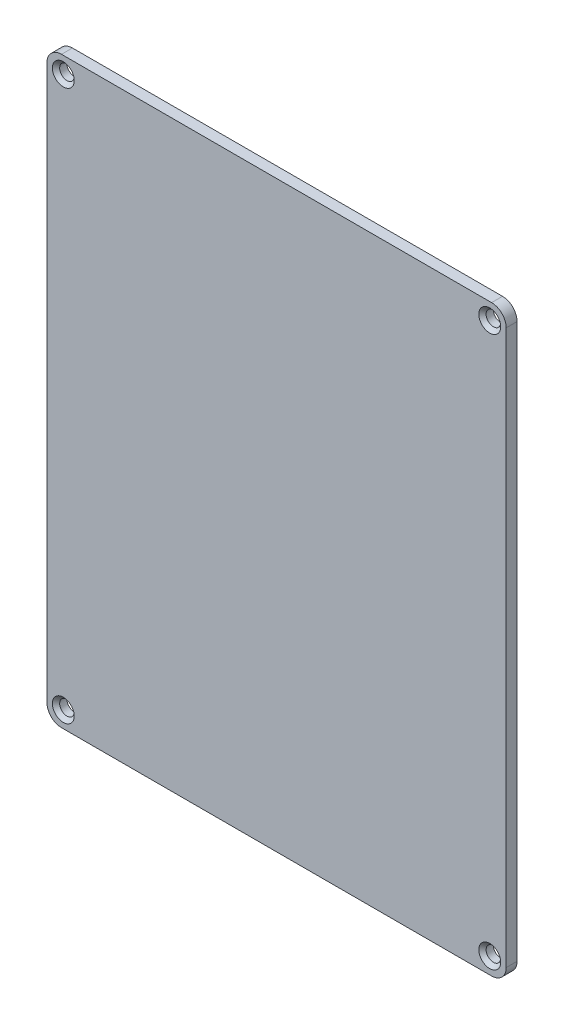
ISO-10303-21;
HEADER;
FILE_DESCRIPTION(('STEP AP214'),'2;1');
FILE_NAME('part.step','',(''),(''),'','','');
FILE_SCHEMA(('AUTOMOTIVE_DESIGN { 1 0 10303 214 1 1 1 1 }'));
ENDSEC;
DATA;
#1=APPLICATION_CONTEXT('core data for automotive mechanical design processes');
#2=APPLICATION_PROTOCOL_DEFINITION('international standard','automotive_design',2000,#1);
#3=PRODUCT_CONTEXT('',#1,'mechanical');
#4=PRODUCT('Part','Part','',(#3));
#5=PRODUCT_RELATED_PRODUCT_CATEGORY('part','',(#4));
#6=PRODUCT_DEFINITION_FORMATION('','',#4);
#7=PRODUCT_DEFINITION_CONTEXT('part definition',#1,'design');
#8=PRODUCT_DEFINITION('design','',#6,#7);
#9=PRODUCT_DEFINITION_SHAPE('','',#8);
#10=(LENGTH_UNIT() NAMED_UNIT(*) SI_UNIT(.MILLI.,.METRE.));
#11=(NAMED_UNIT(*) PLANE_ANGLE_UNIT() SI_UNIT($,.RADIAN.));
#12=(NAMED_UNIT(*) SI_UNIT($,.STERADIAN.) SOLID_ANGLE_UNIT());
#13=UNCERTAINTY_MEASURE_WITH_UNIT(LENGTH_MEASURE(1.E-05),#10,'distance_accuracy_value','');
#14=(GEOMETRIC_REPRESENTATION_CONTEXT(3) GLOBAL_UNCERTAINTY_ASSIGNED_CONTEXT((#13)) GLOBAL_UNIT_ASSIGNED_CONTEXT((#10,
#11,#12)) REPRESENTATION_CONTEXT('',''));
#15=CARTESIAN_POINT('',(0.,0.,0.));
#16=DIRECTION('',(0.,0.,1.));
#17=DIRECTION('',(1.,0.,0.));
#18=AXIS2_PLACEMENT_3D('',#15,#16,#17);
#19=CARTESIAN_POINT('',(31.5,-40.,1.5));
#20=DIRECTION('',(-1.,0.,0.));
#21=DIRECTION('',(0.,0.,1.));
#22=AXIS2_PLACEMENT_3D('',#19,#20,#21);
#23=PLANE('',#22);
#24=DIRECTION('',(0.,1.,0.));
#25=VECTOR('',#24,1.);
#26=CARTESIAN_POINT('',(31.5,-40.,1.5));
#27=LINE('',#26,#25);
#28=CARTESIAN_POINT('',(31.5,-38.,1.5));
#29=VERTEX_POINT('',#28);
#30=CARTESIAN_POINT('',(31.5,38.,1.5));
#31=VERTEX_POINT('',#30);
#32=EDGE_CURVE('E136',#29,#31,#27,.T.);
#33=ORIENTED_EDGE('',*,*,#32,.F.);
#34=DIRECTION('',(0.,0.,-1.));
#35=VECTOR('',#34,1.);
#36=CARTESIAN_POINT('',(31.5,-38.,1.5));
#37=LINE('',#36,#35);
#38=CARTESIAN_POINT('',(31.5,-38.,0.));
#39=VERTEX_POINT('',#38);
#40=EDGE_CURVE('E175',#29,#39,#37,.T.);
#41=ORIENTED_EDGE('',*,*,#40,.T.);
#42=DIRECTION('',(0.,1.,0.));
#43=VECTOR('',#42,1.);
#44=CARTESIAN_POINT('',(31.5,-40.,0.));
#45=LINE('',#44,#43);
#46=CARTESIAN_POINT('',(31.5,38.,0.));
#47=VERTEX_POINT('',#46);
#48=EDGE_CURVE('E272',#39,#47,#45,.T.);
#49=ORIENTED_EDGE('',*,*,#48,.T.);
#50=DIRECTION('',(0.,0.,-1.));
#51=VECTOR('',#50,1.);
#52=CARTESIAN_POINT('',(31.5,38.,1.5));
#53=LINE('',#52,#51);
#54=EDGE_CURVE('E172',#47,#31,#53,.F.);
#55=ORIENTED_EDGE('',*,*,#54,.T.);
#56=EDGE_LOOP('',(#33,#41,#49,#55));
#57=FACE_BOUND('',#56,.T.);
#58=ADVANCED_FACE('F39',(#57),#23,.F.);
#59=CARTESIAN_POINT('',(-31.5,40.,1.5));
#60=DIRECTION('',(0.,-1.,0.));
#61=DIRECTION('',(0.,0.,-1.));
#62=AXIS2_PLACEMENT_3D('',#59,#60,#61);
#63=PLANE('',#62);
#64=DIRECTION('',(-1.,0.,0.));
#65=VECTOR('',#64,1.);
#66=CARTESIAN_POINT('',(-31.5,40.,1.5));
#67=LINE('',#66,#65);
#68=CARTESIAN_POINT('',(29.5,40.,1.5));
#69=VERTEX_POINT('',#68);
#70=CARTESIAN_POINT('',(-29.5,40.,1.5));
#71=VERTEX_POINT('',#70);
#72=EDGE_CURVE('E141',#69,#71,#67,.T.);
#73=ORIENTED_EDGE('',*,*,#72,.F.);
#74=DIRECTION('',(0.,0.,-1.));
#75=VECTOR('',#74,1.);
#76=CARTESIAN_POINT('',(29.5,40.,1.5));
#77=LINE('',#76,#75);
#78=CARTESIAN_POINT('',(29.5,40.,0.));
#79=VERTEX_POINT('',#78);
#80=EDGE_CURVE('E181',#69,#79,#77,.T.);
#81=ORIENTED_EDGE('',*,*,#80,.T.);
#82=DIRECTION('',(-1.,0.,0.));
#83=VECTOR('',#82,1.);
#84=CARTESIAN_POINT('',(-31.5,40.,0.));
#85=LINE('',#84,#83);
#86=CARTESIAN_POINT('',(-29.5,40.,0.));
#87=VERTEX_POINT('',#86);
#88=EDGE_CURVE('E143',#79,#87,#85,.T.);
#89=ORIENTED_EDGE('',*,*,#88,.T.);
#90=DIRECTION('',(0.,0.,-1.));
#91=VECTOR('',#90,1.);
#92=CARTESIAN_POINT('',(-29.5,40.,1.5));
#93=LINE('',#92,#91);
#94=EDGE_CURVE('E55',#87,#71,#93,.F.);
#95=ORIENTED_EDGE('',*,*,#94,.T.);
#96=EDGE_LOOP('',(#73,#81,#89,#95));
#97=FACE_BOUND('',#96,.T.);
#98=ADVANCED_FACE('F229',(#97),#63,.F.);
#99=CARTESIAN_POINT('',(-31.5,-40.,1.5));
#100=DIRECTION('',(1.,0.,0.));
#101=DIRECTION('',(0.,0.,-1.));
#102=AXIS2_PLACEMENT_3D('',#99,#100,#101);
#103=PLANE('',#102);
#104=DIRECTION('',(0.,-1.,0.));
#105=VECTOR('',#104,1.);
#106=CARTESIAN_POINT('',(-31.5,-40.,0.));
#107=LINE('',#106,#105);
#108=CARTESIAN_POINT('',(-31.5,38.,0.));
#109=VERTEX_POINT('',#108);
#110=CARTESIAN_POINT('',(-31.5,-38.,0.));
#111=VERTEX_POINT('',#110);
#112=EDGE_CURVE('E137',#109,#111,#107,.T.);
#113=ORIENTED_EDGE('',*,*,#112,.T.);
#114=DIRECTION('',(0.,0.,-1.));
#115=VECTOR('',#114,1.);
#116=CARTESIAN_POINT('',(-31.5,-38.,1.5));
#117=LINE('',#116,#115);
#118=CARTESIAN_POINT('',(-31.5,-38.,1.5));
#119=VERTEX_POINT('',#118);
#120=EDGE_CURVE('E112',#111,#119,#117,.F.);
#121=ORIENTED_EDGE('',*,*,#120,.T.);
#122=DIRECTION('',(0.,-1.,0.));
#123=VECTOR('',#122,1.);
#124=CARTESIAN_POINT('',(-31.5,-40.,1.5));
#125=LINE('',#124,#123);
#126=CARTESIAN_POINT('',(-31.5,38.,1.5));
#127=VERTEX_POINT('',#126);
#128=EDGE_CURVE('E288',#127,#119,#125,.T.);
#129=ORIENTED_EDGE('',*,*,#128,.F.);
#130=DIRECTION('',(0.,0.,-1.));
#131=VECTOR('',#130,1.);
#132=CARTESIAN_POINT('',(-31.5,38.,1.5));
#133=LINE('',#132,#131);
#134=EDGE_CURVE('E118',#127,#109,#133,.T.);
#135=ORIENTED_EDGE('',*,*,#134,.T.);
#136=EDGE_LOOP('',(#113,#121,#129,#135));
#137=FACE_BOUND('',#136,.T.);
#138=ADVANCED_FACE('F235',(#137),#103,.F.);
#139=CARTESIAN_POINT('',(-31.5,-40.,1.5));
#140=DIRECTION('',(0.,1.,0.));
#141=DIRECTION('',(0.,0.,1.));
#142=AXIS2_PLACEMENT_3D('',#139,#140,#141);
#143=PLANE('',#142);
#144=DIRECTION('',(1.,0.,0.));
#145=VECTOR('',#144,1.);
#146=CARTESIAN_POINT('',(-31.5,-40.,1.5));
#147=LINE('',#146,#145);
#148=CARTESIAN_POINT('',(-29.5,-40.,1.5));
#149=VERTEX_POINT('',#148);
#150=CARTESIAN_POINT('',(29.5,-40.,1.5));
#151=VERTEX_POINT('',#150);
#152=EDGE_CURVE('E128',#149,#151,#147,.T.);
#153=ORIENTED_EDGE('',*,*,#152,.F.);
#154=DIRECTION('',(0.,0.,-1.));
#155=VECTOR('',#154,1.);
#156=CARTESIAN_POINT('',(-29.5,-40.,1.5));
#157=LINE('',#156,#155);
#158=CARTESIAN_POINT('',(-29.5,-40.,0.));
#159=VERTEX_POINT('',#158);
#160=EDGE_CURVE('E111',#149,#159,#157,.T.);
#161=ORIENTED_EDGE('',*,*,#160,.T.);
#162=DIRECTION('',(1.,0.,0.));
#163=VECTOR('',#162,1.);
#164=CARTESIAN_POINT('',(-31.5,-40.,0.));
#165=LINE('',#164,#163);
#166=CARTESIAN_POINT('',(29.5,-40.,0.));
#167=VERTEX_POINT('',#166);
#168=EDGE_CURVE('E125',#159,#167,#165,.T.);
#169=ORIENTED_EDGE('',*,*,#168,.T.);
#170=DIRECTION('',(0.,0.,-1.));
#171=VECTOR('',#170,1.);
#172=CARTESIAN_POINT('',(29.5,-40.,1.5));
#173=LINE('',#172,#171);
#174=EDGE_CURVE('E131',#167,#151,#173,.F.);
#175=ORIENTED_EDGE('',*,*,#174,.T.);
#176=EDGE_LOOP('',(#153,#161,#169,#175));
#177=FACE_BOUND('',#176,.T.);
#178=ADVANCED_FACE('F124',(#177),#143,.F.);
#179=CARTESIAN_POINT('',(0.,0.,1.5));
#180=DIRECTION('',(0.,0.,-1.));
#181=DIRECTION('',(-1.,0.,0.));
#182=AXIS2_PLACEMENT_3D('',#179,#180,#181);
#183=PLANE('',#182);
#184=CARTESIAN_POINT('',(-29.25,37.75,1.5));
#185=DIRECTION('',(0.,0.,-1.));
#186=DIRECTION('',(-1.,0.,0.));
#187=AXIS2_PLACEMENT_3D('',#184,#185,#186);
#188=CIRCLE('',#187,1.49999999999999);
#189=CARTESIAN_POINT('',(-30.75,37.75,1.5));
#190=VERTEX_POINT('',#189);
#191=EDGE_CURVE('E201',#190,#190,#188,.T.);
#192=ORIENTED_EDGE('',*,*,#191,.T.);
#193=EDGE_LOOP('',(#192));
#194=FACE_BOUND('',#193,.T.);
#195=CARTESIAN_POINT('',(29.25,37.75,1.5));
#196=DIRECTION('',(0.,0.,-1.));
#197=DIRECTION('',(-1.,0.,0.));
#198=AXIS2_PLACEMENT_3D('',#195,#196,#197);
#199=CIRCLE('',#198,1.49999999999999);
#200=CARTESIAN_POINT('',(27.75,37.75,1.5));
#201=VERTEX_POINT('',#200);
#202=EDGE_CURVE('E197',#201,#201,#199,.T.);
#203=ORIENTED_EDGE('',*,*,#202,.T.);
#204=EDGE_LOOP('',(#203));
#205=FACE_BOUND('',#204,.T.);
#206=CARTESIAN_POINT('',(-29.25,-37.75,1.5));
#207=DIRECTION('',(0.,0.,-1.));
#208=DIRECTION('',(-1.,0.,0.));
#209=AXIS2_PLACEMENT_3D('',#206,#207,#208);
#210=CIRCLE('',#209,1.49999999999999);
#211=CARTESIAN_POINT('',(-30.75,-37.75,1.5));
#212=VERTEX_POINT('',#211);
#213=EDGE_CURVE('E193',#212,#212,#210,.T.);
#214=ORIENTED_EDGE('',*,*,#213,.T.);
#215=EDGE_LOOP('',(#214));
#216=FACE_BOUND('',#215,.T.);
#217=CARTESIAN_POINT('',(29.25,-37.75,1.5));
#218=DIRECTION('',(0.,0.,-1.));
#219=DIRECTION('',(-1.,0.,0.));
#220=AXIS2_PLACEMENT_3D('',#217,#218,#219);
#221=CIRCLE('',#220,1.49999999999999);
#222=CARTESIAN_POINT('',(27.75,-37.75,1.5));
#223=VERTEX_POINT('',#222);
#224=EDGE_CURVE('E189',#223,#223,#221,.T.);
#225=ORIENTED_EDGE('',*,*,#224,.T.);
#226=EDGE_LOOP('',(#225));
#227=FACE_BOUND('',#226,.T.);
#228=ORIENTED_EDGE('',*,*,#128,.T.);
#229=CARTESIAN_POINT('',(-29.5,-38.,1.5));
#230=DIRECTION('',(0.,0.,-1.));
#231=DIRECTION('',(-1.,0.,0.));
#232=AXIS2_PLACEMENT_3D('',#229,#230,#231);
#233=CIRCLE('',#232,2.);
#234=EDGE_CURVE('E169',#119,#149,#233,.F.);
#235=ORIENTED_EDGE('',*,*,#234,.T.);
#236=ORIENTED_EDGE('',*,*,#152,.T.);
#237=CARTESIAN_POINT('',(29.5,-38.,1.5));
#238=DIRECTION('',(0.,0.,-1.));
#239=DIRECTION('',(-1.,0.,0.));
#240=AXIS2_PLACEMENT_3D('',#237,#238,#239);
#241=CIRCLE('',#240,2.);
#242=EDGE_CURVE('E166',#151,#29,#241,.F.);
#243=ORIENTED_EDGE('',*,*,#242,.T.);
#244=ORIENTED_EDGE('',*,*,#32,.T.);
#245=CARTESIAN_POINT('',(29.5,38.,1.5));
#246=DIRECTION('',(0.,0.,-1.));
#247=DIRECTION('',(-1.,0.,0.));
#248=AXIS2_PLACEMENT_3D('',#245,#246,#247);
#249=CIRCLE('',#248,2.);
#250=EDGE_CURVE('E62',#31,#69,#249,.F.);
#251=ORIENTED_EDGE('',*,*,#250,.T.);
#252=ORIENTED_EDGE('',*,*,#72,.T.);
#253=CARTESIAN_POINT('',(-29.5,38.,1.5));
#254=DIRECTION('',(0.,0.,-1.));
#255=DIRECTION('',(-1.,0.,0.));
#256=AXIS2_PLACEMENT_3D('',#253,#254,#255);
#257=CIRCLE('',#256,2.);
#258=EDGE_CURVE('E161',#71,#127,#257,.F.);
#259=ORIENTED_EDGE('',*,*,#258,.T.);
#260=EDGE_LOOP('',(#228,#235,#236,#243,#244,#251,#252,#259));
#261=FACE_BOUND('',#260,.T.);
#262=ADVANCED_FACE('F299',(#194,#205,#216,#227,#261),#183,.F.);
#263=CARTESIAN_POINT('',(0.,0.,0.));
#264=DIRECTION('',(0.,0.,-1.));
#265=DIRECTION('',(-1.,0.,0.));
#266=AXIS2_PLACEMENT_3D('',#263,#264,#265);
#267=PLANE('',#266);
#268=CARTESIAN_POINT('',(-29.25,-37.75,0.));
#269=DIRECTION('',(0.,0.,1.));
#270=DIRECTION('',(-1.,0.,0.));
#271=AXIS2_PLACEMENT_3D('',#268,#269,#270);
#272=CIRCLE('',#271,1.);
#273=CARTESIAN_POINT('',(-30.25,-37.75,0.));
#274=VERTEX_POINT('',#273);
#275=EDGE_CURVE('E283',#274,#274,#272,.T.);
#276=ORIENTED_EDGE('',*,*,#275,.T.);
#277=EDGE_LOOP('',(#276));
#278=FACE_BOUND('',#277,.T.);
#279=CARTESIAN_POINT('',(29.25,-37.75,0.));
#280=DIRECTION('',(0.,0.,1.));
#281=DIRECTION('',(1.,0.,0.));
#282=AXIS2_PLACEMENT_3D('',#279,#280,#281);
#283=CIRCLE('',#282,1.);
#284=CARTESIAN_POINT('',(30.25,-37.75,0.));
#285=VERTEX_POINT('',#284);
#286=EDGE_CURVE('E280',#285,#285,#283,.T.);
#287=ORIENTED_EDGE('',*,*,#286,.T.);
#288=EDGE_LOOP('',(#287));
#289=FACE_BOUND('',#288,.T.);
#290=CARTESIAN_POINT('',(29.25,37.75,0.));
#291=DIRECTION('',(0.,0.,1.));
#292=DIRECTION('',(-1.,0.,0.));
#293=AXIS2_PLACEMENT_3D('',#290,#291,#292);
#294=CIRCLE('',#293,1.);
#295=CARTESIAN_POINT('',(28.25,37.75,0.));
#296=VERTEX_POINT('',#295);
#297=EDGE_CURVE('E273',#296,#296,#294,.T.);
#298=ORIENTED_EDGE('',*,*,#297,.T.);
#299=EDGE_LOOP('',(#298));
#300=FACE_BOUND('',#299,.T.);
#301=CARTESIAN_POINT('',(-29.25,37.75,0.));
#302=DIRECTION('',(0.,0.,1.));
#303=DIRECTION('',(1.,0.,0.));
#304=AXIS2_PLACEMENT_3D('',#301,#302,#303);
#305=CIRCLE('',#304,1.);
#306=CARTESIAN_POINT('',(-28.25,37.75,0.));
#307=VERTEX_POINT('',#306);
#308=EDGE_CURVE('E269',#307,#307,#305,.T.);
#309=ORIENTED_EDGE('',*,*,#308,.T.);
#310=EDGE_LOOP('',(#309));
#311=FACE_BOUND('',#310,.T.);
#312=ORIENTED_EDGE('',*,*,#168,.F.);
#313=CARTESIAN_POINT('',(-29.5,-38.,0.));
#314=DIRECTION('',(0.,0.,-1.));
#315=DIRECTION('',(-1.,0.,0.));
#316=AXIS2_PLACEMENT_3D('',#313,#314,#315);
#317=CIRCLE('',#316,2.);
#318=EDGE_CURVE('E107',#159,#111,#317,.T.);
#319=ORIENTED_EDGE('',*,*,#318,.T.);
#320=ORIENTED_EDGE('',*,*,#112,.F.);
#321=CARTESIAN_POINT('',(-29.5,38.,0.));
#322=DIRECTION('',(0.,0.,-1.));
#323=DIRECTION('',(-1.,0.,0.));
#324=AXIS2_PLACEMENT_3D('',#321,#322,#323);
#325=CIRCLE('',#324,2.);
#326=EDGE_CURVE('E130',#109,#87,#325,.T.);
#327=ORIENTED_EDGE('',*,*,#326,.T.);
#328=ORIENTED_EDGE('',*,*,#88,.F.);
#329=CARTESIAN_POINT('',(29.5,38.,0.));
#330=DIRECTION('',(0.,0.,-1.));
#331=DIRECTION('',(-1.,0.,0.));
#332=AXIS2_PLACEMENT_3D('',#329,#330,#331);
#333=CIRCLE('',#332,2.);
#334=EDGE_CURVE('E151',#79,#47,#333,.T.);
#335=ORIENTED_EDGE('',*,*,#334,.T.);
#336=ORIENTED_EDGE('',*,*,#48,.F.);
#337=CARTESIAN_POINT('',(29.5,-38.,0.));
#338=DIRECTION('',(0.,0.,-1.));
#339=DIRECTION('',(-1.,0.,0.));
#340=AXIS2_PLACEMENT_3D('',#337,#338,#339);
#341=CIRCLE('',#340,2.);
#342=EDGE_CURVE('E119',#39,#167,#341,.T.);
#343=ORIENTED_EDGE('',*,*,#342,.T.);
#344=EDGE_LOOP('',(#312,#319,#320,#327,#328,#335,#336,#343));
#345=FACE_BOUND('',#344,.T.);
#346=ADVANCED_FACE('F133',(#278,#289,#300,#311,#345),#267,.T.);
#347=CARTESIAN_POINT('',(-29.25,37.75,0.));
#348=DIRECTION('',(0.,0.,1.));
#349=DIRECTION('',(1.,0.,0.));
#350=AXIS2_PLACEMENT_3D('',#347,#348,#349);
#351=CYLINDRICAL_SURFACE('',#350,1.);
#352=CARTESIAN_POINT('',(-29.25,37.75,1.00000000000001));
#353=DIRECTION('',(0.,0.,-1.));
#354=DIRECTION('',(-1.,0.,0.));
#355=AXIS2_PLACEMENT_3D('',#352,#353,#354);
#356=CIRCLE('',#355,1.);
#357=CARTESIAN_POINT('',(-30.25,37.75,1.00000000000001));
#358=VERTEX_POINT('',#357);
#359=EDGE_CURVE('E185',#358,#358,#356,.F.);
#360=ORIENTED_EDGE('',*,*,#359,.T.);
#361=EDGE_LOOP('',(#360));
#362=FACE_BOUND('',#361,.T.);
#363=ORIENTED_EDGE('',*,*,#308,.F.);
#364=EDGE_LOOP('',(#363));
#365=FACE_BOUND('',#364,.T.);
#366=ADVANCED_FACE('F262',(#362,#365),#351,.F.);
#367=CARTESIAN_POINT('',(29.25,37.75,0.));
#368=DIRECTION('',(0.,0.,1.));
#369=DIRECTION('',(1.,0.,0.));
#370=AXIS2_PLACEMENT_3D('',#367,#368,#369);
#371=CYLINDRICAL_SURFACE('',#370,1.);
#372=CARTESIAN_POINT('',(29.25,37.75,1.00000000000001));
#373=DIRECTION('',(0.,0.,-1.));
#374=DIRECTION('',(-1.,0.,0.));
#375=AXIS2_PLACEMENT_3D('',#372,#373,#374);
#376=CIRCLE('',#375,1.);
#377=CARTESIAN_POINT('',(28.25,37.75,1.00000000000001));
#378=VERTEX_POINT('',#377);
#379=EDGE_CURVE('E205',#378,#378,#376,.F.);
#380=ORIENTED_EDGE('',*,*,#379,.T.);
#381=EDGE_LOOP('',(#380));
#382=FACE_BOUND('',#381,.T.);
#383=ORIENTED_EDGE('',*,*,#297,.F.);
#384=EDGE_LOOP('',(#383));
#385=FACE_BOUND('',#384,.T.);
#386=ADVANCED_FACE('F265',(#382,#385),#371,.F.);
#387=CARTESIAN_POINT('',(29.25,-37.75,0.));
#388=DIRECTION('',(0.,0.,1.));
#389=DIRECTION('',(1.,0.,0.));
#390=AXIS2_PLACEMENT_3D('',#387,#388,#389);
#391=CYLINDRICAL_SURFACE('',#390,1.);
#392=CARTESIAN_POINT('',(29.25,-37.75,1.00000000000001));
#393=DIRECTION('',(0.,0.,-1.));
#394=DIRECTION('',(-1.,0.,0.));
#395=AXIS2_PLACEMENT_3D('',#392,#393,#394);
#396=CIRCLE('',#395,1.);
#397=CARTESIAN_POINT('',(28.25,-37.75,1.00000000000001));
#398=VERTEX_POINT('',#397);
#399=EDGE_CURVE('E11',#398,#398,#396,.F.);
#400=ORIENTED_EDGE('',*,*,#399,.T.);
#401=EDGE_LOOP('',(#400));
#402=FACE_BOUND('',#401,.T.);
#403=ORIENTED_EDGE('',*,*,#286,.F.);
#404=EDGE_LOOP('',(#403));
#405=FACE_BOUND('',#404,.T.);
#406=ADVANCED_FACE('F315',(#402,#405),#391,.F.);
#407=CARTESIAN_POINT('',(-29.25,-37.75,0.));
#408=DIRECTION('',(0.,0.,1.));
#409=DIRECTION('',(1.,0.,0.));
#410=AXIS2_PLACEMENT_3D('',#407,#408,#409);
#411=CYLINDRICAL_SURFACE('',#410,1.);
#412=CARTESIAN_POINT('',(-29.25,-37.75,1.00000000000001));
#413=DIRECTION('',(0.,0.,-1.));
#414=DIRECTION('',(-1.,0.,0.));
#415=AXIS2_PLACEMENT_3D('',#412,#413,#414);
#416=CIRCLE('',#415,1.);
#417=CARTESIAN_POINT('',(-30.25,-37.75,1.00000000000001));
#418=VERTEX_POINT('',#417);
#419=EDGE_CURVE('E48',#418,#418,#416,.F.);
#420=ORIENTED_EDGE('',*,*,#419,.T.);
#421=EDGE_LOOP('',(#420));
#422=FACE_BOUND('',#421,.T.);
#423=ORIENTED_EDGE('',*,*,#275,.F.);
#424=EDGE_LOOP('',(#423));
#425=FACE_BOUND('',#424,.T.);
#426=ADVANCED_FACE('F212',(#422,#425),#411,.F.);
#427=CARTESIAN_POINT('',(-29.5,-38.,1.5));
#428=DIRECTION('',(0.,0.,-1.));
#429=DIRECTION('',(-1.,0.,0.));
#430=AXIS2_PLACEMENT_3D('',#427,#428,#429);
#431=CYLINDRICAL_SURFACE('',#430,2.);
#432=ORIENTED_EDGE('',*,*,#234,.F.);
#433=ORIENTED_EDGE('',*,*,#120,.F.);
#434=ORIENTED_EDGE('',*,*,#318,.F.);
#435=ORIENTED_EDGE('',*,*,#160,.F.);
#436=EDGE_LOOP('',(#432,#433,#434,#435));
#437=FACE_BOUND('',#436,.T.);
#438=ADVANCED_FACE('F110',(#437),#431,.T.);
#439=CARTESIAN_POINT('',(29.5,-38.,1.5));
#440=DIRECTION('',(0.,0.,-1.));
#441=DIRECTION('',(-1.,0.,0.));
#442=AXIS2_PLACEMENT_3D('',#439,#440,#441);
#443=CYLINDRICAL_SURFACE('',#442,2.);
#444=ORIENTED_EDGE('',*,*,#242,.F.);
#445=ORIENTED_EDGE('',*,*,#174,.F.);
#446=ORIENTED_EDGE('',*,*,#342,.F.);
#447=ORIENTED_EDGE('',*,*,#40,.F.);
#448=EDGE_LOOP('',(#444,#445,#446,#447));
#449=FACE_BOUND('',#448,.T.);
#450=ADVANCED_FACE('F242',(#449),#443,.T.);
#451=CARTESIAN_POINT('',(29.5,38.,1.5));
#452=DIRECTION('',(0.,0.,-1.));
#453=DIRECTION('',(-1.,0.,0.));
#454=AXIS2_PLACEMENT_3D('',#451,#452,#453);
#455=CYLINDRICAL_SURFACE('',#454,2.);
#456=ORIENTED_EDGE('',*,*,#250,.F.);
#457=ORIENTED_EDGE('',*,*,#54,.F.);
#458=ORIENTED_EDGE('',*,*,#334,.F.);
#459=ORIENTED_EDGE('',*,*,#80,.F.);
#460=EDGE_LOOP('',(#456,#457,#458,#459));
#461=FACE_BOUND('',#460,.T.);
#462=ADVANCED_FACE('F245',(#461),#455,.T.);
#463=CARTESIAN_POINT('',(-29.5,38.,1.5));
#464=DIRECTION('',(0.,0.,-1.));
#465=DIRECTION('',(-1.,0.,0.));
#466=AXIS2_PLACEMENT_3D('',#463,#464,#465);
#467=CYLINDRICAL_SURFACE('',#466,2.);
#468=ORIENTED_EDGE('',*,*,#258,.F.);
#469=ORIENTED_EDGE('',*,*,#94,.F.);
#470=ORIENTED_EDGE('',*,*,#326,.F.);
#471=ORIENTED_EDGE('',*,*,#134,.F.);
#472=EDGE_LOOP('',(#468,#469,#470,#471));
#473=FACE_BOUND('',#472,.T.);
#474=ADVANCED_FACE('F249',(#473),#467,.T.);
#475=CARTESIAN_POINT('',(-29.25,37.75,1.00000000000001));
#476=DIRECTION('',(0.,0.,1.));
#477=DIRECTION('',(1.,0.,0.));
#478=AXIS2_PLACEMENT_3D('',#475,#476,#477);
#479=CONICAL_SURFACE('',#478,1.,0.785398163397445);
#480=ORIENTED_EDGE('',*,*,#191,.F.);
#481=EDGE_LOOP('',(#480));
#482=FACE_BOUND('',#481,.T.);
#483=ORIENTED_EDGE('',*,*,#359,.F.);
#484=EDGE_LOOP('',(#483));
#485=FACE_BOUND('',#484,.T.);
#486=ADVANCED_FACE('F224',(#482,#485),#479,.F.);
#487=CARTESIAN_POINT('',(29.25,37.75,1.00000000000001));
#488=DIRECTION('',(0.,0.,1.));
#489=DIRECTION('',(1.,0.,0.));
#490=AXIS2_PLACEMENT_3D('',#487,#488,#489);
#491=CONICAL_SURFACE('',#490,1.,0.785398163397445);
#492=ORIENTED_EDGE('',*,*,#202,.F.);
#493=EDGE_LOOP('',(#492));
#494=FACE_BOUND('',#493,.T.);
#495=ORIENTED_EDGE('',*,*,#379,.F.);
#496=EDGE_LOOP('',(#495));
#497=FACE_BOUND('',#496,.T.);
#498=ADVANCED_FACE('F217',(#494,#497),#491,.F.);
#499=CARTESIAN_POINT('',(-29.25,-37.75,1.00000000000001));
#500=DIRECTION('',(0.,0.,1.));
#501=DIRECTION('',(1.,0.,0.));
#502=AXIS2_PLACEMENT_3D('',#499,#500,#501);
#503=CONICAL_SURFACE('',#502,1.,0.785398163397445);
#504=ORIENTED_EDGE('',*,*,#213,.F.);
#505=EDGE_LOOP('',(#504));
#506=FACE_BOUND('',#505,.T.);
#507=ORIENTED_EDGE('',*,*,#419,.F.);
#508=EDGE_LOOP('',(#507));
#509=FACE_BOUND('',#508,.T.);
#510=ADVANCED_FACE('F215',(#506,#509),#503,.F.);
#511=CARTESIAN_POINT('',(29.25,-37.75,1.00000000000001));
#512=DIRECTION('',(0.,0.,1.));
#513=DIRECTION('',(1.,0.,0.));
#514=AXIS2_PLACEMENT_3D('',#511,#512,#513);
#515=CONICAL_SURFACE('',#514,1.,0.785398163397445);
#516=ORIENTED_EDGE('',*,*,#224,.F.);
#517=EDGE_LOOP('',(#516));
#518=FACE_BOUND('',#517,.T.);
#519=ORIENTED_EDGE('',*,*,#399,.F.);
#520=EDGE_LOOP('',(#519));
#521=FACE_BOUND('',#520,.T.);
#522=ADVANCED_FACE('F41',(#518,#521),#515,.F.);
#523=CLOSED_SHELL('',(#58,#98,#138,#178,#262,#346,#366,#386,#406,#426,#438,#450,#462,#474,#486,
#498,#510,#522));
#524=MANIFOLD_SOLID_BREP('B2',#523);
#525=ADVANCED_BREP_SHAPE_REPRESENTATION('',(#18,#524),#14);
#526=SHAPE_DEFINITION_REPRESENTATION(#9,#525);
ENDSEC;
END-ISO-10303-21;
